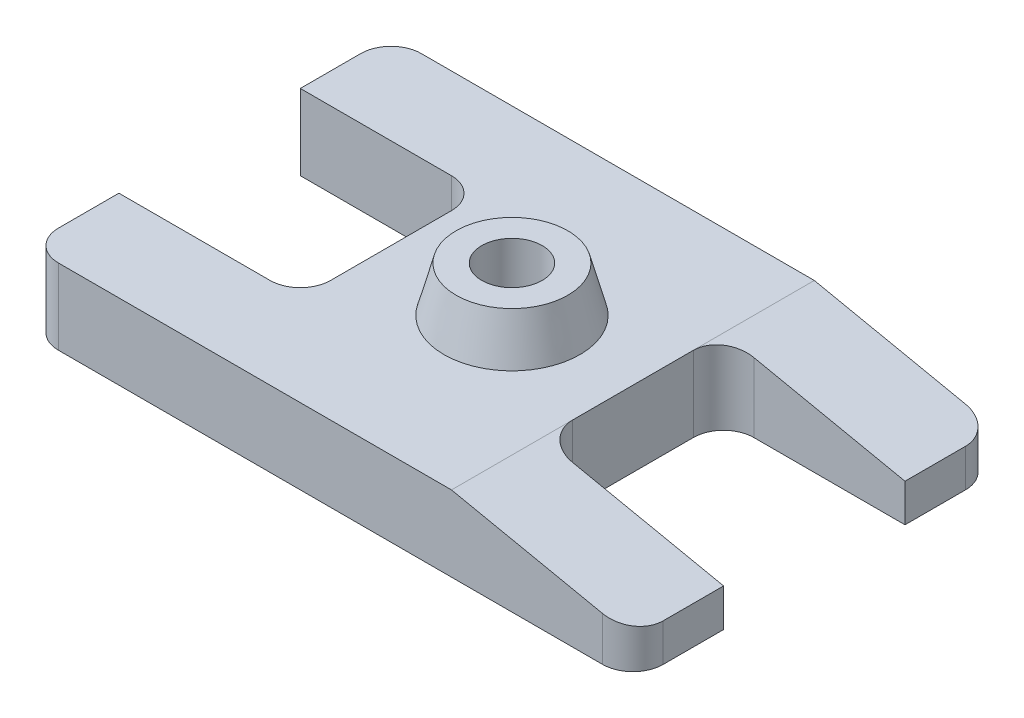
ISO-10303-21;
HEADER;
FILE_DESCRIPTION(('STEP AP214'),'2;1');
FILE_NAME('part.step','',(''),(''),'','','');
FILE_SCHEMA(('AUTOMOTIVE_DESIGN { 1 0 10303 214 1 1 1 1 }'));
ENDSEC;
DATA;
#1=APPLICATION_CONTEXT('core data for automotive mechanical design processes');
#2=APPLICATION_PROTOCOL_DEFINITION('international standard','automotive_design',2000,#1);
#3=PRODUCT_CONTEXT('',#1,'mechanical');
#4=PRODUCT('Part','Part','',(#3));
#5=PRODUCT_RELATED_PRODUCT_CATEGORY('part','',(#4));
#6=PRODUCT_DEFINITION_FORMATION('','',#4);
#7=PRODUCT_DEFINITION_CONTEXT('part definition',#1,'design');
#8=PRODUCT_DEFINITION('design','',#6,#7);
#9=PRODUCT_DEFINITION_SHAPE('','',#8);
#10=(LENGTH_UNIT() NAMED_UNIT(*) SI_UNIT(.MILLI.,.METRE.));
#11=(NAMED_UNIT(*) PLANE_ANGLE_UNIT() SI_UNIT($,.RADIAN.));
#12=(NAMED_UNIT(*) SI_UNIT($,.STERADIAN.) SOLID_ANGLE_UNIT());
#13=UNCERTAINTY_MEASURE_WITH_UNIT(LENGTH_MEASURE(1.E-05),#10,'distance_accuracy_value','');
#14=(GEOMETRIC_REPRESENTATION_CONTEXT(3) GLOBAL_UNCERTAINTY_ASSIGNED_CONTEXT((#13)) GLOBAL_UNIT_ASSIGNED_CONTEXT((#10,
#11,#12)) REPRESENTATION_CONTEXT('',''));
#15=CARTESIAN_POINT('',(0.,0.,0.));
#16=DIRECTION('',(0.,0.,1.));
#17=DIRECTION('',(1.,0.,0.));
#18=AXIS2_PLACEMENT_3D('',#15,#16,#17);
#19=CARTESIAN_POINT('',(-100.,25.,60.));
#20=DIRECTION('',(1.,0.,0.));
#21=DIRECTION('',(0.,0.,-1.));
#22=AXIS2_PLACEMENT_3D('',#19,#20,#21);
#23=PLANE('',#22);
#24=DIRECTION('',(0.,0.,1.));
#25=VECTOR('',#24,1.);
#26=CARTESIAN_POINT('',(-100.,0.,60.));
#27=LINE('',#26,#25);
#28=CARTESIAN_POINT('',(-100.,0.,-50.));
#29=VERTEX_POINT('',#28);
#30=CARTESIAN_POINT('',(-100.,0.,-30.));
#31=VERTEX_POINT('',#30);
#32=EDGE_CURVE('E230',#29,#31,#27,.T.);
#33=ORIENTED_EDGE('',*,*,#32,.T.);
#34=DIRECTION('',(0.,1.,0.));
#35=VECTOR('',#34,1.);
#36=CARTESIAN_POINT('',(-100.,0.,-30.));
#37=LINE('',#36,#35);
#38=CARTESIAN_POINT('',(-100.,25.,-30.));
#39=VERTEX_POINT('',#38);
#40=EDGE_CURVE('E361',#31,#39,#37,.T.);
#41=ORIENTED_EDGE('',*,*,#40,.T.);
#42=DIRECTION('',(0.,0.,1.));
#43=VECTOR('',#42,1.);
#44=CARTESIAN_POINT('',(-100.,25.,60.));
#45=LINE('',#44,#43);
#46=CARTESIAN_POINT('',(-100.,25.,-50.));
#47=VERTEX_POINT('',#46);
#48=EDGE_CURVE('E219',#47,#39,#45,.T.);
#49=ORIENTED_EDGE('',*,*,#48,.F.);
#50=DIRECTION('',(0.,-1.,0.));
#51=VECTOR('',#50,1.);
#52=CARTESIAN_POINT('',(-100.,25.,-50.));
#53=LINE('',#52,#51);
#54=EDGE_CURVE('E256',#47,#29,#53,.T.);
#55=ORIENTED_EDGE('',*,*,#54,.T.);
#56=EDGE_LOOP('',(#33,#41,#49,#55));
#57=FACE_BOUND('',#56,.T.);
#58=ADVANCED_FACE('F45',(#57),#23,.F.);
#59=CARTESIAN_POINT('',(100.,25.,60.));
#60=DIRECTION('',(-1.,0.,0.));
#61=DIRECTION('',(0.,0.,1.));
#62=AXIS2_PLACEMENT_3D('',#59,#60,#61);
#63=PLANE('',#62);
#64=DIRECTION('',(0.,-1.,0.));
#65=VECTOR('',#64,1.);
#66=CARTESIAN_POINT('',(100.,25.,-50.));
#67=LINE('',#66,#65);
#68=CARTESIAN_POINT('',(100.,0.,-50.));
#69=VERTEX_POINT('',#68);
#70=CARTESIAN_POINT('',(100.,12.5,-50.));
#71=VERTEX_POINT('',#70);
#72=EDGE_CURVE('E289',#69,#71,#67,.F.);
#73=ORIENTED_EDGE('',*,*,#72,.T.);
#74=DIRECTION('',(0.,0.,1.));
#75=VECTOR('',#74,1.);
#76=CARTESIAN_POINT('',(100.,12.5,-60.));
#77=LINE('',#76,#75);
#78=CARTESIAN_POINT('',(100.,12.5,-30.));
#79=VERTEX_POINT('',#78);
#80=EDGE_CURVE('E508',#71,#79,#77,.T.);
#81=ORIENTED_EDGE('',*,*,#80,.T.);
#82=DIRECTION('',(0.,1.,0.));
#83=VECTOR('',#82,1.);
#84=CARTESIAN_POINT('',(100.,0.,-30.));
#85=LINE('',#84,#83);
#86=CARTESIAN_POINT('',(100.,0.,-30.));
#87=VERTEX_POINT('',#86);
#88=EDGE_CURVE('E388',#87,#79,#85,.T.);
#89=ORIENTED_EDGE('',*,*,#88,.F.);
#90=DIRECTION('',(0.,0.,-1.));
#91=VECTOR('',#90,1.);
#92=CARTESIAN_POINT('',(100.,0.,60.));
#93=LINE('',#92,#91);
#94=EDGE_CURVE('E238',#87,#69,#93,.T.);
#95=ORIENTED_EDGE('',*,*,#94,.T.);
#96=EDGE_LOOP('',(#73,#81,#89,#95));
#97=FACE_BOUND('',#96,.T.);
#98=ADVANCED_FACE('F463',(#97),#63,.F.);
#99=CARTESIAN_POINT('',(0.,25.,0.));
#100=DIRECTION('',(0.,-1.,0.));
#101=DIRECTION('',(0.,0.,-1.));
#102=AXIS2_PLACEMENT_3D('',#99,#100,#101);
#103=PLANE('',#102);
#104=DIRECTION('',(1.,0.,0.));
#105=VECTOR('',#104,1.);
#106=CARTESIAN_POINT('',(-100.,25.,60.));
#107=LINE('',#106,#105);
#108=CARTESIAN_POINT('',(-90.,25.,60.));
#109=VERTEX_POINT('',#108);
#110=CARTESIAN_POINT('',(40.,25.,60.));
#111=VERTEX_POINT('',#110);
#112=EDGE_CURVE('E206',#109,#111,#107,.T.);
#113=ORIENTED_EDGE('',*,*,#112,.T.);
#114=DIRECTION('',(0.,0.,1.));
#115=VECTOR('',#114,1.);
#116=CARTESIAN_POINT('',(40.,25.,-60.));
#117=LINE('',#116,#115);
#118=CARTESIAN_POINT('',(40.,25.,20.));
#119=VERTEX_POINT('',#118);
#120=EDGE_CURVE('E187',#119,#111,#117,.T.);
#121=ORIENTED_EDGE('',*,*,#120,.F.);
#122=DIRECTION('',(0.,0.,1.));
#123=VECTOR('',#122,1.);
#124=CARTESIAN_POINT('',(40.,25.,-30.));
#125=LINE('',#124,#123);
#126=CARTESIAN_POINT('',(40.,25.,-20.));
#127=VERTEX_POINT('',#126);
#128=EDGE_CURVE('E376',#127,#119,#125,.T.);
#129=ORIENTED_EDGE('',*,*,#128,.F.);
#130=CARTESIAN_POINT('',(40.,25.,-60.));
#131=VERTEX_POINT('',#130);
#132=EDGE_CURVE('E198',#131,#127,#117,.T.);
#133=ORIENTED_EDGE('',*,*,#132,.F.);
#134=DIRECTION('',(-1.,0.,0.));
#135=VECTOR('',#134,1.);
#136=CARTESIAN_POINT('',(-100.,25.,-60.));
#137=LINE('',#136,#135);
#138=CARTESIAN_POINT('',(-90.,25.,-60.));
#139=VERTEX_POINT('',#138);
#140=EDGE_CURVE('E218',#131,#139,#137,.T.);
#141=ORIENTED_EDGE('',*,*,#140,.T.);
#142=CARTESIAN_POINT('',(-90.,25.,-50.));
#143=DIRECTION('',(0.,-1.,0.));
#144=DIRECTION('',(0.,0.,-1.));
#145=AXIS2_PLACEMENT_3D('',#142,#143,#144);
#146=CIRCLE('',#145,10.);
#147=EDGE_CURVE('E283',#139,#47,#146,.F.);
#148=ORIENTED_EDGE('',*,*,#147,.T.);
#149=ORIENTED_EDGE('',*,*,#48,.T.);
#150=DIRECTION('',(-1.,0.,0.));
#151=VECTOR('',#150,1.);
#152=CARTESIAN_POINT('',(-100.,25.,-30.));
#153=LINE('',#152,#151);
#154=CARTESIAN_POINT('',(-50.,25.,-30.));
#155=VERTEX_POINT('',#154);
#156=EDGE_CURVE('E345',#155,#39,#153,.T.);
#157=ORIENTED_EDGE('',*,*,#156,.F.);
#158=CARTESIAN_POINT('',(-50.,25.,-20.));
#159=DIRECTION('',(0.,-1.,0.));
#160=DIRECTION('',(0.,0.,-1.));
#161=AXIS2_PLACEMENT_3D('',#158,#159,#160);
#162=CIRCLE('',#161,10.);
#163=CARTESIAN_POINT('',(-40.,25.,-20.));
#164=VERTEX_POINT('',#163);
#165=EDGE_CURVE('E338',#155,#164,#162,.T.);
#166=ORIENTED_EDGE('',*,*,#165,.T.);
#167=DIRECTION('',(0.,0.,-1.));
#168=VECTOR('',#167,1.);
#169=CARTESIAN_POINT('',(-40.,25.,-30.));
#170=LINE('',#169,#168);
#171=CARTESIAN_POINT('',(-40.,25.,20.));
#172=VERTEX_POINT('',#171);
#173=EDGE_CURVE('E344',#172,#164,#170,.T.);
#174=ORIENTED_EDGE('',*,*,#173,.F.);
#175=CARTESIAN_POINT('',(-50.,25.,20.));
#176=DIRECTION('',(0.,-1.,0.));
#177=DIRECTION('',(0.,0.,-1.));
#178=AXIS2_PLACEMENT_3D('',#175,#176,#177);
#179=CIRCLE('',#178,10.);
#180=CARTESIAN_POINT('',(-50.,25.,30.));
#181=VERTEX_POINT('',#180);
#182=EDGE_CURVE('E332',#172,#181,#179,.T.);
#183=ORIENTED_EDGE('',*,*,#182,.T.);
#184=DIRECTION('',(1.,0.,0.));
#185=VECTOR('',#184,1.);
#186=CARTESIAN_POINT('',(-40.,25.,30.));
#187=LINE('',#186,#185);
#188=CARTESIAN_POINT('',(-100.,25.,30.));
#189=VERTEX_POINT('',#188);
#190=EDGE_CURVE('E354',#189,#181,#187,.T.);
#191=ORIENTED_EDGE('',*,*,#190,.F.);
#192=CARTESIAN_POINT('',(-100.,25.,50.));
#193=VERTEX_POINT('',#192);
#194=EDGE_CURVE('E226',#189,#193,#45,.T.);
#195=ORIENTED_EDGE('',*,*,#194,.T.);
#196=CARTESIAN_POINT('',(-90.,25.,50.));
#197=DIRECTION('',(0.,-1.,0.));
#198=DIRECTION('',(0.,0.,-1.));
#199=AXIS2_PLACEMENT_3D('',#196,#197,#198);
#200=CIRCLE('',#199,10.);
#201=EDGE_CURVE('E216',#193,#109,#200,.F.);
#202=ORIENTED_EDGE('',*,*,#201,.T.);
#203=EDGE_LOOP('',(#113,#121,#129,#133,#141,#148,#149,#157,#166,#174,#183,#191,#195,#202));
#204=FACE_BOUND('',#203,.T.);
#205=CARTESIAN_POINT('',(0.,25.,0.));
#206=DIRECTION('',(0.,1.,0.));
#207=DIRECTION('',(0.,0.,1.));
#208=AXIS2_PLACEMENT_3D('',#205,#206,#207);
#209=CIRCLE('',#208,22.5);
#210=CARTESIAN_POINT('',(0.,25.,22.5));
#211=VERTEX_POINT('',#210);
#212=EDGE_CURVE('E251',#211,#211,#209,.T.);
#213=ORIENTED_EDGE('',*,*,#212,.F.);
#214=EDGE_LOOP('',(#213));
#215=FACE_BOUND('',#214,.T.);
#216=ADVANCED_FACE('F213',(#204,#215),#103,.F.);
#217=CARTESIAN_POINT('',(0.,0.,0.));
#218=DIRECTION('',(0.,-1.,0.));
#219=DIRECTION('',(0.,0.,-1.));
#220=AXIS2_PLACEMENT_3D('',#217,#218,#219);
#221=PLANE('',#220);
#222=DIRECTION('',(0.,0.,-1.));
#223=VECTOR('',#222,1.);
#224=CARTESIAN_POINT('',(-40.,0.,-30.));
#225=LINE('',#224,#223);
#226=CARTESIAN_POINT('',(-40.,0.,20.));
#227=VERTEX_POINT('',#226);
#228=CARTESIAN_POINT('',(-40.,0.,-20.));
#229=VERTEX_POINT('',#228);
#230=EDGE_CURVE('E365',#227,#229,#225,.T.);
#231=ORIENTED_EDGE('',*,*,#230,.T.);
#232=CARTESIAN_POINT('',(-50.,0.,-20.));
#233=DIRECTION('',(0.,-1.,0.));
#234=DIRECTION('',(0.,0.,-1.));
#235=AXIS2_PLACEMENT_3D('',#232,#233,#234);
#236=CIRCLE('',#235,10.);
#237=CARTESIAN_POINT('',(-50.,0.,-30.));
#238=VERTEX_POINT('',#237);
#239=EDGE_CURVE('E54',#229,#238,#236,.F.);
#240=ORIENTED_EDGE('',*,*,#239,.T.);
#241=DIRECTION('',(-1.,0.,0.));
#242=VECTOR('',#241,1.);
#243=CARTESIAN_POINT('',(-100.,0.,-30.));
#244=LINE('',#243,#242);
#245=EDGE_CURVE('E360',#238,#31,#244,.T.);
#246=ORIENTED_EDGE('',*,*,#245,.T.);
#247=ORIENTED_EDGE('',*,*,#32,.F.);
#248=CARTESIAN_POINT('',(-90.,0.,-50.));
#249=DIRECTION('',(0.,-1.,0.));
#250=DIRECTION('',(0.,0.,-1.));
#251=AXIS2_PLACEMENT_3D('',#248,#249,#250);
#252=CIRCLE('',#251,10.);
#253=CARTESIAN_POINT('',(-90.,0.,-60.));
#254=VERTEX_POINT('',#253);
#255=EDGE_CURVE('E271',#29,#254,#252,.T.);
#256=ORIENTED_EDGE('',*,*,#255,.T.);
#257=DIRECTION('',(-1.,0.,0.));
#258=VECTOR('',#257,1.);
#259=CARTESIAN_POINT('',(-100.,0.,-60.));
#260=LINE('',#259,#258);
#261=CARTESIAN_POINT('',(90.,0.,-60.));
#262=VERTEX_POINT('',#261);
#263=EDGE_CURVE('E243',#262,#254,#260,.T.);
#264=ORIENTED_EDGE('',*,*,#263,.F.);
#265=CARTESIAN_POINT('',(90.,0.,-50.));
#266=DIRECTION('',(0.,-1.,0.));
#267=DIRECTION('',(0.,0.,-1.));
#268=AXIS2_PLACEMENT_3D('',#265,#266,#267);
#269=CIRCLE('',#268,10.);
#270=EDGE_CURVE('E267',#262,#69,#269,.T.);
#271=ORIENTED_EDGE('',*,*,#270,.T.);
#272=ORIENTED_EDGE('',*,*,#94,.F.);
#273=DIRECTION('',(-1.,0.,0.));
#274=VECTOR('',#273,1.);
#275=CARTESIAN_POINT('',(100.,0.,-30.));
#276=LINE('',#275,#274);
#277=CARTESIAN_POINT('',(50.,0.,-30.));
#278=VERTEX_POINT('',#277);
#279=EDGE_CURVE('E395',#87,#278,#276,.T.);
#280=ORIENTED_EDGE('',*,*,#279,.T.);
#281=CARTESIAN_POINT('',(50.,0.,-20.));
#282=DIRECTION('',(0.,-1.,0.));
#283=DIRECTION('',(0.,0.,-1.));
#284=AXIS2_PLACEMENT_3D('',#281,#282,#283);
#285=CIRCLE('',#284,10.);
#286=CARTESIAN_POINT('',(40.,0.,-20.));
#287=VERTEX_POINT('',#286);
#288=EDGE_CURVE('E329',#278,#287,#285,.F.);
#289=ORIENTED_EDGE('',*,*,#288,.T.);
#290=DIRECTION('',(0.,0.,1.));
#291=VECTOR('',#290,1.);
#292=CARTESIAN_POINT('',(40.,0.,-30.));
#293=LINE('',#292,#291);
#294=CARTESIAN_POINT('',(40.,0.,20.));
#295=VERTEX_POINT('',#294);
#296=EDGE_CURVE('E398',#287,#295,#293,.T.);
#297=ORIENTED_EDGE('',*,*,#296,.T.);
#298=CARTESIAN_POINT('',(50.,0.,20.));
#299=DIRECTION('',(0.,-1.,0.));
#300=DIRECTION('',(0.,0.,-1.));
#301=AXIS2_PLACEMENT_3D('',#298,#299,#300);
#302=CIRCLE('',#301,10.);
#303=CARTESIAN_POINT('',(50.,0.,30.));
#304=VERTEX_POINT('',#303);
#305=EDGE_CURVE('E326',#295,#304,#302,.F.);
#306=ORIENTED_EDGE('',*,*,#305,.T.);
#307=DIRECTION('',(1.,0.,0.));
#308=VECTOR('',#307,1.);
#309=CARTESIAN_POINT('',(40.,0.,30.));
#310=LINE('',#309,#308);
#311=CARTESIAN_POINT('',(100.,0.,30.));
#312=VERTEX_POINT('',#311);
#313=EDGE_CURVE('E387',#304,#312,#310,.T.);
#314=ORIENTED_EDGE('',*,*,#313,.T.);
#315=CARTESIAN_POINT('',(100.,0.,50.));
#316=VERTEX_POINT('',#315);
#317=EDGE_CURVE('E239',#316,#312,#93,.T.);
#318=ORIENTED_EDGE('',*,*,#317,.F.);
#319=CARTESIAN_POINT('',(90.,0.,50.));
#320=DIRECTION('',(0.,-1.,0.));
#321=DIRECTION('',(0.,0.,-1.));
#322=AXIS2_PLACEMENT_3D('',#319,#320,#321);
#323=CIRCLE('',#322,10.);
#324=CARTESIAN_POINT('',(90.,0.,60.));
#325=VERTEX_POINT('',#324);
#326=EDGE_CURVE('E264',#316,#325,#323,.T.);
#327=ORIENTED_EDGE('',*,*,#326,.T.);
#328=DIRECTION('',(1.,0.,0.));
#329=VECTOR('',#328,1.);
#330=CARTESIAN_POINT('',(-100.,0.,60.));
#331=LINE('',#330,#329);
#332=CARTESIAN_POINT('',(-90.,0.,60.));
#333=VERTEX_POINT('',#332);
#334=EDGE_CURVE('E234',#333,#325,#331,.T.);
#335=ORIENTED_EDGE('',*,*,#334,.F.);
#336=CARTESIAN_POINT('',(-90.,0.,50.));
#337=DIRECTION('',(0.,-1.,0.));
#338=DIRECTION('',(0.,0.,-1.));
#339=AXIS2_PLACEMENT_3D('',#336,#337,#338);
#340=CIRCLE('',#339,10.);
#341=CARTESIAN_POINT('',(-100.,0.,50.));
#342=VERTEX_POINT('',#341);
#343=EDGE_CURVE('E260',#333,#342,#340,.T.);
#344=ORIENTED_EDGE('',*,*,#343,.T.);
#345=CARTESIAN_POINT('',(-100.,0.,30.));
#346=VERTEX_POINT('',#345);
#347=EDGE_CURVE('E235',#346,#342,#27,.T.);
#348=ORIENTED_EDGE('',*,*,#347,.F.);
#349=DIRECTION('',(1.,0.,0.));
#350=VECTOR('',#349,1.);
#351=CARTESIAN_POINT('',(-40.,0.,30.));
#352=LINE('',#351,#350);
#353=CARTESIAN_POINT('',(-50.,0.,30.));
#354=VERTEX_POINT('',#353);
#355=EDGE_CURVE('E370',#346,#354,#352,.T.);
#356=ORIENTED_EDGE('',*,*,#355,.T.);
#357=CARTESIAN_POINT('',(-50.,0.,20.));
#358=DIRECTION('',(0.,-1.,0.));
#359=DIRECTION('',(0.,0.,-1.));
#360=AXIS2_PLACEMENT_3D('',#357,#358,#359);
#361=CIRCLE('',#360,10.);
#362=EDGE_CURVE('E335',#354,#227,#361,.F.);
#363=ORIENTED_EDGE('',*,*,#362,.T.);
#364=EDGE_LOOP('',(#231,#240,#246,#247,#256,#264,#271,#272,#280,#289,#297,#306,#314,#318,#327,
#335,#344,#348,#356,#363));
#365=FACE_BOUND('',#364,.T.);
#366=CARTESIAN_POINT('',(0.,0.,0.));
#367=DIRECTION('',(0.,1.,0.));
#368=DIRECTION('',(0.,0.,1.));
#369=AXIS2_PLACEMENT_3D('',#366,#367,#368);
#370=CIRCLE('',#369,10.);
#371=CARTESIAN_POINT('',(0.,0.,10.));
#372=VERTEX_POINT('',#371);
#373=EDGE_CURVE('E252',#372,#372,#370,.T.);
#374=ORIENTED_EDGE('',*,*,#373,.T.);
#375=EDGE_LOOP('',(#374));
#376=FACE_BOUND('',#375,.T.);
#377=ADVANCED_FACE('F423',(#365,#376),#221,.T.);
#378=ORIENTED_EDGE('',*,*,#194,.F.);
#379=DIRECTION('',(0.,1.,0.));
#380=VECTOR('',#379,1.);
#381=CARTESIAN_POINT('',(-100.,0.,30.));
#382=LINE('',#381,#380);
#383=EDGE_CURVE('E364',#346,#189,#382,.T.);
#384=ORIENTED_EDGE('',*,*,#383,.F.);
#385=ORIENTED_EDGE('',*,*,#347,.T.);
#386=DIRECTION('',(0.,-1.,0.));
#387=VECTOR('',#386,1.);
#388=CARTESIAN_POINT('',(-100.,25.,50.));
#389=LINE('',#388,#387);
#390=EDGE_CURVE('E223',#342,#193,#389,.F.);
#391=ORIENTED_EDGE('',*,*,#390,.T.);
#392=EDGE_LOOP('',(#378,#384,#385,#391));
#393=FACE_BOUND('',#392,.T.);
#394=ADVANCED_FACE('F419',(#393),#23,.F.);
#395=CARTESIAN_POINT('',(-100.,25.,60.));
#396=DIRECTION('',(0.,0.,-1.));
#397=DIRECTION('',(-1.,0.,0.));
#398=AXIS2_PLACEMENT_3D('',#395,#396,#397);
#399=PLANE('',#398);
#400=DIRECTION('',(0.,-1.,0.));
#401=VECTOR('',#400,1.);
#402=CARTESIAN_POINT('',(90.,25.,60.));
#403=LINE('',#402,#401);
#404=CARTESIAN_POINT('',(90.,14.5833333333333,60.));
#405=VERTEX_POINT('',#404);
#406=EDGE_CURVE('E210',#325,#405,#403,.F.);
#407=ORIENTED_EDGE('',*,*,#406,.T.);
#408=DIRECTION('',(0.978980419737605,-0.203954254112001,0.));
#409=VECTOR('',#408,1.);
#410=CARTESIAN_POINT('',(40.,25.,60.));
#411=LINE('',#410,#409);
#412=EDGE_CURVE('E190',#111,#405,#411,.T.);
#413=ORIENTED_EDGE('',*,*,#412,.F.);
#414=ORIENTED_EDGE('',*,*,#112,.F.);
#415=DIRECTION('',(0.,-1.,0.));
#416=VECTOR('',#415,1.);
#417=CARTESIAN_POINT('',(-90.,25.,60.));
#418=LINE('',#417,#416);
#419=EDGE_CURVE('E293',#109,#333,#418,.T.);
#420=ORIENTED_EDGE('',*,*,#419,.T.);
#421=ORIENTED_EDGE('',*,*,#334,.T.);
#422=EDGE_LOOP('',(#407,#413,#414,#420,#421));
#423=FACE_BOUND('',#422,.T.);
#424=ADVANCED_FACE('F204',(#423),#399,.F.);
#425=DIRECTION('',(0.,1.,0.));
#426=VECTOR('',#425,1.);
#427=CARTESIAN_POINT('',(100.,0.,30.));
#428=LINE('',#427,#426);
#429=CARTESIAN_POINT('',(100.,12.5,30.));
#430=VERTEX_POINT('',#429);
#431=EDGE_CURVE('E383',#312,#430,#428,.T.);
#432=ORIENTED_EDGE('',*,*,#431,.T.);
#433=CARTESIAN_POINT('',(100.,12.5,50.));
#434=VERTEX_POINT('',#433);
#435=EDGE_CURVE('E497',#430,#434,#77,.T.);
#436=ORIENTED_EDGE('',*,*,#435,.T.);
#437=DIRECTION('',(0.,-1.,0.));
#438=VECTOR('',#437,1.);
#439=CARTESIAN_POINT('',(100.,25.,50.));
#440=LINE('',#439,#438);
#441=EDGE_CURVE('E286',#434,#316,#440,.T.);
#442=ORIENTED_EDGE('',*,*,#441,.T.);
#443=ORIENTED_EDGE('',*,*,#317,.T.);
#444=EDGE_LOOP('',(#432,#436,#442,#443));
#445=FACE_BOUND('',#444,.T.);
#446=ADVANCED_FACE('F473',(#445),#63,.F.);
#447=CARTESIAN_POINT('',(-100.,25.,-60.));
#448=DIRECTION('',(0.,0.,1.));
#449=DIRECTION('',(1.,0.,0.));
#450=AXIS2_PLACEMENT_3D('',#447,#448,#449);
#451=PLANE('',#450);
#452=ORIENTED_EDGE('',*,*,#140,.F.);
#453=DIRECTION('',(0.978980419737605,-0.203954254112001,0.));
#454=VECTOR('',#453,1.);
#455=CARTESIAN_POINT('',(40.,25.,-60.));
#456=LINE('',#455,#454);
#457=CARTESIAN_POINT('',(90.,14.5833333333333,-60.));
#458=VERTEX_POINT('',#457);
#459=EDGE_CURVE('E199',#131,#458,#456,.T.);
#460=ORIENTED_EDGE('',*,*,#459,.T.);
#461=DIRECTION('',(0.,-1.,0.));
#462=VECTOR('',#461,1.);
#463=CARTESIAN_POINT('',(90.,25.,-60.));
#464=LINE('',#463,#462);
#465=EDGE_CURVE('E274',#458,#262,#464,.T.);
#466=ORIENTED_EDGE('',*,*,#465,.T.);
#467=ORIENTED_EDGE('',*,*,#263,.T.);
#468=DIRECTION('',(0.,-1.,0.));
#469=VECTOR('',#468,1.);
#470=CARTESIAN_POINT('',(-90.,25.,-60.));
#471=LINE('',#470,#469);
#472=EDGE_CURVE('E277',#254,#139,#471,.F.);
#473=ORIENTED_EDGE('',*,*,#472,.T.);
#474=EDGE_LOOP('',(#452,#460,#466,#467,#473));
#475=FACE_BOUND('',#474,.T.);
#476=ADVANCED_FACE('F488',(#475),#451,.F.);
#477=CARTESIAN_POINT('',(0.,25.,0.));
#478=DIRECTION('',(0.,-1.,0.));
#479=DIRECTION('',(0.,0.,1.));
#480=AXIS2_PLACEMENT_3D('',#477,#478,#479);
#481=CONICAL_SURFACE('',#480,22.5,0.26179938779915);
#482=CARTESIAN_POINT('',(0.,40.,0.));
#483=DIRECTION('',(0.,1.,0.));
#484=DIRECTION('',(0.,0.,1.));
#485=AXIS2_PLACEMENT_3D('',#482,#483,#484);
#486=CIRCLE('',#485,18.4807621135331);
#487=CARTESIAN_POINT('',(0.,40.,18.4807621135331));
#488=VERTEX_POINT('',#487);
#489=EDGE_CURVE('E247',#488,#488,#486,.T.);
#490=ORIENTED_EDGE('',*,*,#489,.F.);
#491=EDGE_LOOP('',(#490));
#492=FACE_BOUND('',#491,.T.);
#493=ORIENTED_EDGE('',*,*,#212,.T.);
#494=EDGE_LOOP('',(#493));
#495=FACE_BOUND('',#494,.T.);
#496=ADVANCED_FACE('F490',(#492,#495),#481,.T.);
#497=CARTESIAN_POINT('',(0.,40.,0.));
#498=DIRECTION('',(0.,1.,0.));
#499=DIRECTION('',(0.,0.,1.));
#500=AXIS2_PLACEMENT_3D('',#497,#498,#499);
#501=PLANE('',#500);
#502=CARTESIAN_POINT('',(0.,40.,0.));
#503=DIRECTION('',(0.,1.,0.));
#504=DIRECTION('',(0.,0.,1.));
#505=AXIS2_PLACEMENT_3D('',#502,#503,#504);
#506=CIRCLE('',#505,10.);
#507=CARTESIAN_POINT('',(0.,40.,10.));
#508=VERTEX_POINT('',#507);
#509=EDGE_CURVE('E381',#508,#508,#506,.T.);
#510=ORIENTED_EDGE('',*,*,#509,.F.);
#511=EDGE_LOOP('',(#510));
#512=FACE_BOUND('',#511,.T.);
#513=ORIENTED_EDGE('',*,*,#489,.T.);
#514=EDGE_LOOP('',(#513));
#515=FACE_BOUND('',#514,.T.);
#516=ADVANCED_FACE('F560',(#512,#515),#501,.T.);
#517=CARTESIAN_POINT('',(0.,0.,0.));
#518=DIRECTION('',(0.,1.,0.));
#519=DIRECTION('',(0.,0.,1.));
#520=AXIS2_PLACEMENT_3D('',#517,#518,#519);
#521=CYLINDRICAL_SURFACE('',#520,10.);
#522=ORIENTED_EDGE('',*,*,#373,.F.);
#523=EDGE_LOOP('',(#522));
#524=FACE_BOUND('',#523,.T.);
#525=ORIENTED_EDGE('',*,*,#509,.T.);
#526=EDGE_LOOP('',(#525));
#527=FACE_BOUND('',#526,.T.);
#528=ADVANCED_FACE('F558',(#524,#527),#521,.F.);
#529=CARTESIAN_POINT('',(-90.,25.,-50.));
#530=DIRECTION('',(0.,-1.,0.));
#531=DIRECTION('',(0.,0.,-1.));
#532=AXIS2_PLACEMENT_3D('',#529,#530,#531);
#533=CYLINDRICAL_SURFACE('',#532,10.);
#534=ORIENTED_EDGE('',*,*,#147,.F.);
#535=ORIENTED_EDGE('',*,*,#472,.F.);
#536=ORIENTED_EDGE('',*,*,#255,.F.);
#537=ORIENTED_EDGE('',*,*,#54,.F.);
#538=EDGE_LOOP('',(#534,#535,#536,#537));
#539=FACE_BOUND('',#538,.T.);
#540=ADVANCED_FACE('F530',(#539),#533,.T.);
#541=CARTESIAN_POINT('',(90.,25.,-50.));
#542=DIRECTION('',(0.,-1.,0.));
#543=DIRECTION('',(0.,0.,-1.));
#544=AXIS2_PLACEMENT_3D('',#541,#542,#543);
#545=CYLINDRICAL_SURFACE('',#544,10.);
#546=CARTESIAN_POINT('',(90.,14.5833333333333,-50.));
#547=DIRECTION('',(-0.203954254112001,-0.978980419737605,0.));
#548=DIRECTION('',(0.978980419737605,-0.203954254112001,0.));
#549=AXIS2_PLACEMENT_3D('',#546,#547,#548);
#550=ELLIPSE('',#549,10.2147088934427,10.);
#551=EDGE_CURVE('E392',#71,#458,#550,.F.);
#552=ORIENTED_EDGE('',*,*,#551,.F.);
#553=ORIENTED_EDGE('',*,*,#72,.F.);
#554=ORIENTED_EDGE('',*,*,#270,.F.);
#555=ORIENTED_EDGE('',*,*,#465,.F.);
#556=EDGE_LOOP('',(#552,#553,#554,#555));
#557=FACE_BOUND('',#556,.T.);
#558=ADVANCED_FACE('F523',(#557),#545,.T.);
#559=CARTESIAN_POINT('',(90.,25.,50.));
#560=DIRECTION('',(0.,-1.,0.));
#561=DIRECTION('',(0.,0.,-1.));
#562=AXIS2_PLACEMENT_3D('',#559,#560,#561);
#563=CYLINDRICAL_SURFACE('',#562,10.);
#564=CARTESIAN_POINT('',(90.,14.5833333333333,50.));
#565=DIRECTION('',(-0.203954254112001,-0.978980419737605,0.));
#566=DIRECTION('',(0.978980419737605,-0.203954254112001,0.));
#567=AXIS2_PLACEMENT_3D('',#564,#565,#566);
#568=ELLIPSE('',#567,10.2147088934427,10.);
#569=EDGE_CURVE('E432',#405,#434,#568,.F.);
#570=ORIENTED_EDGE('',*,*,#569,.F.);
#571=ORIENTED_EDGE('',*,*,#406,.F.);
#572=ORIENTED_EDGE('',*,*,#326,.F.);
#573=ORIENTED_EDGE('',*,*,#441,.F.);
#574=EDGE_LOOP('',(#570,#571,#572,#573));
#575=FACE_BOUND('',#574,.T.);
#576=ADVANCED_FACE('F429',(#575),#563,.T.);
#577=CARTESIAN_POINT('',(-90.,25.,50.));
#578=DIRECTION('',(0.,-1.,0.));
#579=DIRECTION('',(0.,0.,-1.));
#580=AXIS2_PLACEMENT_3D('',#577,#578,#579);
#581=CYLINDRICAL_SURFACE('',#580,10.);
#582=ORIENTED_EDGE('',*,*,#201,.F.);
#583=ORIENTED_EDGE('',*,*,#390,.F.);
#584=ORIENTED_EDGE('',*,*,#343,.F.);
#585=ORIENTED_EDGE('',*,*,#419,.F.);
#586=EDGE_LOOP('',(#582,#583,#584,#585));
#587=FACE_BOUND('',#586,.T.);
#588=ADVANCED_FACE('F426',(#587),#581,.T.);
#589=CARTESIAN_POINT('',(100.,0.,-30.));
#590=DIRECTION('',(0.,0.,-1.));
#591=DIRECTION('',(-1.,0.,0.));
#592=AXIS2_PLACEMENT_3D('',#589,#590,#591);
#593=PLANE('',#592);
#594=ORIENTED_EDGE('',*,*,#88,.T.);
#595=DIRECTION('',(-0.978980419737605,0.203954254112001,0.));
#596=VECTOR('',#595,1.);
#597=CARTESIAN_POINT('',(102.495840266223,11.9800332778702,-30.));
#598=LINE('',#597,#596);
#599=CARTESIAN_POINT('',(50.,22.9166666666667,-30.));
#600=VERTEX_POINT('',#599);
#601=EDGE_CURVE('E505',#79,#600,#598,.T.);
#602=ORIENTED_EDGE('',*,*,#601,.T.);
#603=DIRECTION('',(0.,1.,0.));
#604=VECTOR('',#603,1.);
#605=CARTESIAN_POINT('',(50.,0.,-30.));
#606=LINE('',#605,#604);
#607=EDGE_CURVE('E309',#600,#278,#606,.F.);
#608=ORIENTED_EDGE('',*,*,#607,.T.);
#609=ORIENTED_EDGE('',*,*,#279,.F.);
#610=EDGE_LOOP('',(#594,#602,#608,#609));
#611=FACE_BOUND('',#610,.T.);
#612=ADVANCED_FACE('F543',(#611),#593,.F.);
#613=CARTESIAN_POINT('',(40.,0.,30.));
#614=DIRECTION('',(0.,0.,1.));
#615=DIRECTION('',(1.,0.,0.));
#616=AXIS2_PLACEMENT_3D('',#613,#614,#615);
#617=PLANE('',#616);
#618=DIRECTION('',(0.,1.,0.));
#619=VECTOR('',#618,1.);
#620=CARTESIAN_POINT('',(50.,25.,30.));
#621=LINE('',#620,#619);
#622=CARTESIAN_POINT('',(50.,22.9166666666667,30.));
#623=VERTEX_POINT('',#622);
#624=EDGE_CURVE('E298',#304,#623,#621,.T.);
#625=ORIENTED_EDGE('',*,*,#624,.T.);
#626=DIRECTION('',(0.978980419737605,-0.203954254112001,0.));
#627=VECTOR('',#626,1.);
#628=CARTESIAN_POINT('',(44.9916805324459,23.9600665557404,30.));
#629=LINE('',#628,#627);
#630=EDGE_CURVE('E61',#623,#430,#629,.T.);
#631=ORIENTED_EDGE('',*,*,#630,.T.);
#632=ORIENTED_EDGE('',*,*,#431,.F.);
#633=ORIENTED_EDGE('',*,*,#313,.F.);
#634=EDGE_LOOP('',(#625,#631,#632,#633));
#635=FACE_BOUND('',#634,.T.);
#636=ADVANCED_FACE('F500',(#635),#617,.F.);
#637=CARTESIAN_POINT('',(40.,0.,-30.));
#638=DIRECTION('',(-1.,0.,0.));
#639=DIRECTION('',(0.,0.,1.));
#640=AXIS2_PLACEMENT_3D('',#637,#638,#639);
#641=PLANE('',#640);
#642=ORIENTED_EDGE('',*,*,#128,.T.);
#643=DIRECTION('',(0.,1.,0.));
#644=VECTOR('',#643,1.);
#645=CARTESIAN_POINT('',(40.,0.,20.));
#646=LINE('',#645,#644);
#647=EDGE_CURVE('E306',#119,#295,#646,.F.);
#648=ORIENTED_EDGE('',*,*,#647,.T.);
#649=ORIENTED_EDGE('',*,*,#296,.F.);
#650=DIRECTION('',(0.,1.,0.));
#651=VECTOR('',#650,1.);
#652=CARTESIAN_POINT('',(40.,25.,-20.));
#653=LINE('',#652,#651);
#654=EDGE_CURVE('E302',#287,#127,#653,.T.);
#655=ORIENTED_EDGE('',*,*,#654,.T.);
#656=EDGE_LOOP('',(#642,#648,#649,#655));
#657=FACE_BOUND('',#656,.T.);
#658=ADVANCED_FACE('F540',(#657),#641,.F.);
#659=CARTESIAN_POINT('',(-100.,0.,-30.));
#660=DIRECTION('',(0.,0.,-1.));
#661=DIRECTION('',(-1.,0.,0.));
#662=AXIS2_PLACEMENT_3D('',#659,#660,#661);
#663=PLANE('',#662);
#664=ORIENTED_EDGE('',*,*,#245,.F.);
#665=DIRECTION('',(0.,1.,0.));
#666=VECTOR('',#665,1.);
#667=CARTESIAN_POINT('',(-50.,25.,-30.));
#668=LINE('',#667,#666);
#669=EDGE_CURVE('E322',#238,#155,#668,.T.);
#670=ORIENTED_EDGE('',*,*,#669,.T.);
#671=ORIENTED_EDGE('',*,*,#156,.T.);
#672=ORIENTED_EDGE('',*,*,#40,.F.);
#673=EDGE_LOOP('',(#664,#670,#671,#672));
#674=FACE_BOUND('',#673,.T.);
#675=ADVANCED_FACE('F357',(#674),#663,.F.);
#676=CARTESIAN_POINT('',(-40.,0.,-30.));
#677=DIRECTION('',(1.,0.,0.));
#678=DIRECTION('',(0.,0.,-1.));
#679=AXIS2_PLACEMENT_3D('',#676,#677,#678);
#680=PLANE('',#679);
#681=ORIENTED_EDGE('',*,*,#230,.F.);
#682=DIRECTION('',(0.,1.,0.));
#683=VECTOR('',#682,1.);
#684=CARTESIAN_POINT('',(-40.,25.,20.));
#685=LINE('',#684,#683);
#686=EDGE_CURVE('E315',#227,#172,#685,.T.);
#687=ORIENTED_EDGE('',*,*,#686,.T.);
#688=ORIENTED_EDGE('',*,*,#173,.T.);
#689=DIRECTION('',(0.,1.,0.));
#690=VECTOR('',#689,1.);
#691=CARTESIAN_POINT('',(-40.,0.,-20.));
#692=LINE('',#691,#690);
#693=EDGE_CURVE('E312',#164,#229,#692,.F.);
#694=ORIENTED_EDGE('',*,*,#693,.T.);
#695=EDGE_LOOP('',(#681,#687,#688,#694));
#696=FACE_BOUND('',#695,.T.);
#697=ADVANCED_FACE('F351',(#696),#680,.F.);
#698=CARTESIAN_POINT('',(-40.,0.,30.));
#699=DIRECTION('',(0.,0.,1.));
#700=DIRECTION('',(1.,0.,0.));
#701=AXIS2_PLACEMENT_3D('',#698,#699,#700);
#702=PLANE('',#701);
#703=ORIENTED_EDGE('',*,*,#190,.T.);
#704=DIRECTION('',(0.,1.,0.));
#705=VECTOR('',#704,1.);
#706=CARTESIAN_POINT('',(-50.,0.,30.));
#707=LINE('',#706,#705);
#708=EDGE_CURVE('E319',#181,#354,#707,.F.);
#709=ORIENTED_EDGE('',*,*,#708,.T.);
#710=ORIENTED_EDGE('',*,*,#355,.F.);
#711=ORIENTED_EDGE('',*,*,#383,.T.);
#712=EDGE_LOOP('',(#703,#709,#710,#711));
#713=FACE_BOUND('',#712,.T.);
#714=ADVANCED_FACE('F448',(#713),#702,.F.);
#715=CARTESIAN_POINT('',(50.,0.,20.));
#716=DIRECTION('',(0.,-1.,0.));
#717=DIRECTION('',(0.,0.,-1.));
#718=AXIS2_PLACEMENT_3D('',#715,#716,#717);
#719=CYLINDRICAL_SURFACE('',#718,10.);
#720=ORIENTED_EDGE('',*,*,#647,.F.);
#721=CARTESIAN_POINT('',(50.,22.9166666666667,20.));
#722=DIRECTION('',(-0.203954254112001,-0.978980419737605,0.));
#723=DIRECTION('',(0.978980419737605,-0.203954254112001,0.));
#724=AXIS2_PLACEMENT_3D('',#721,#722,#723);
#725=ELLIPSE('',#724,10.2147088934427,10.);
#726=EDGE_CURVE('E192',#119,#623,#725,.F.);
#727=ORIENTED_EDGE('',*,*,#726,.T.);
#728=ORIENTED_EDGE('',*,*,#624,.F.);
#729=ORIENTED_EDGE('',*,*,#305,.F.);
#730=EDGE_LOOP('',(#720,#727,#728,#729));
#731=FACE_BOUND('',#730,.T.);
#732=ADVANCED_FACE('F450',(#731),#719,.F.);
#733=CARTESIAN_POINT('',(50.,0.,-20.));
#734=DIRECTION('',(0.,-1.,0.));
#735=DIRECTION('',(0.,0.,-1.));
#736=AXIS2_PLACEMENT_3D('',#733,#734,#735);
#737=CYLINDRICAL_SURFACE('',#736,10.);
#738=ORIENTED_EDGE('',*,*,#607,.F.);
#739=CARTESIAN_POINT('',(50.,22.9166666666667,-20.));
#740=DIRECTION('',(-0.203954254112001,-0.978980419737605,0.));
#741=DIRECTION('',(0.978980419737605,-0.203954254112001,0.));
#742=AXIS2_PLACEMENT_3D('',#739,#740,#741);
#743=ELLIPSE('',#742,10.2147088934427,10.);
#744=EDGE_CURVE('E11',#600,#127,#743,.F.);
#745=ORIENTED_EDGE('',*,*,#744,.T.);
#746=ORIENTED_EDGE('',*,*,#654,.F.);
#747=ORIENTED_EDGE('',*,*,#288,.F.);
#748=EDGE_LOOP('',(#738,#745,#746,#747));
#749=FACE_BOUND('',#748,.T.);
#750=ADVANCED_FACE('F457',(#749),#737,.F.);
#751=CARTESIAN_POINT('',(-50.,0.,20.));
#752=DIRECTION('',(0.,-1.,0.));
#753=DIRECTION('',(0.,0.,-1.));
#754=AXIS2_PLACEMENT_3D('',#751,#752,#753);
#755=CYLINDRICAL_SURFACE('',#754,10.);
#756=ORIENTED_EDGE('',*,*,#362,.F.);
#757=ORIENTED_EDGE('',*,*,#708,.F.);
#758=ORIENTED_EDGE('',*,*,#182,.F.);
#759=ORIENTED_EDGE('',*,*,#686,.F.);
#760=EDGE_LOOP('',(#756,#757,#758,#759));
#761=FACE_BOUND('',#760,.T.);
#762=ADVANCED_FACE('F446',(#761),#755,.F.);
#763=CARTESIAN_POINT('',(-50.,0.,-20.));
#764=DIRECTION('',(0.,-1.,0.));
#765=DIRECTION('',(0.,0.,-1.));
#766=AXIS2_PLACEMENT_3D('',#763,#764,#765);
#767=CYLINDRICAL_SURFACE('',#766,10.);
#768=ORIENTED_EDGE('',*,*,#239,.F.);
#769=ORIENTED_EDGE('',*,*,#693,.F.);
#770=ORIENTED_EDGE('',*,*,#165,.F.);
#771=ORIENTED_EDGE('',*,*,#669,.F.);
#772=EDGE_LOOP('',(#768,#769,#770,#771));
#773=FACE_BOUND('',#772,.T.);
#774=ADVANCED_FACE('F47',(#773),#767,.F.);
#775=CARTESIAN_POINT('',(40.,25.,-60.));
#776=DIRECTION('',(-0.203954254112001,-0.978980419737605,0.));
#777=DIRECTION('',(0.978980419737605,-0.203954254112001,0.));
#778=AXIS2_PLACEMENT_3D('',#775,#776,#777);
#779=PLANE('',#778);
#780=ORIENTED_EDGE('',*,*,#551,.T.);
#781=ORIENTED_EDGE('',*,*,#459,.F.);
#782=ORIENTED_EDGE('',*,*,#132,.T.);
#783=ORIENTED_EDGE('',*,*,#744,.F.);
#784=ORIENTED_EDGE('',*,*,#601,.F.);
#785=ORIENTED_EDGE('',*,*,#80,.F.);
#786=EDGE_LOOP('',(#780,#781,#782,#783,#784,#785));
#787=FACE_BOUND('',#786,.T.);
#788=ADVANCED_FACE('F533',(#787),#779,.F.);
#789=ORIENTED_EDGE('',*,*,#569,.T.);
#790=ORIENTED_EDGE('',*,*,#435,.F.);
#791=ORIENTED_EDGE('',*,*,#630,.F.);
#792=ORIENTED_EDGE('',*,*,#726,.F.);
#793=ORIENTED_EDGE('',*,*,#120,.T.);
#794=ORIENTED_EDGE('',*,*,#412,.T.);
#795=EDGE_LOOP('',(#789,#790,#791,#792,#793,#794));
#796=FACE_BOUND('',#795,.T.);
#797=ADVANCED_FACE('F189',(#796),#779,.F.);
#798=CLOSED_SHELL('',(#58,#98,#216,#377,#394,#424,#446,#476,#496,#516,#528,#540,#558,#576,#588,
#612,#636,#658,#675,#697,#714,#732,#750,#762,#774,#788,#797));
#799=MANIFOLD_SOLID_BREP('B2',#798);
#800=ADVANCED_BREP_SHAPE_REPRESENTATION('',(#18,#799),#14);
#801=SHAPE_DEFINITION_REPRESENTATION(#9,#800);
ENDSEC;
END-ISO-10303-21;
